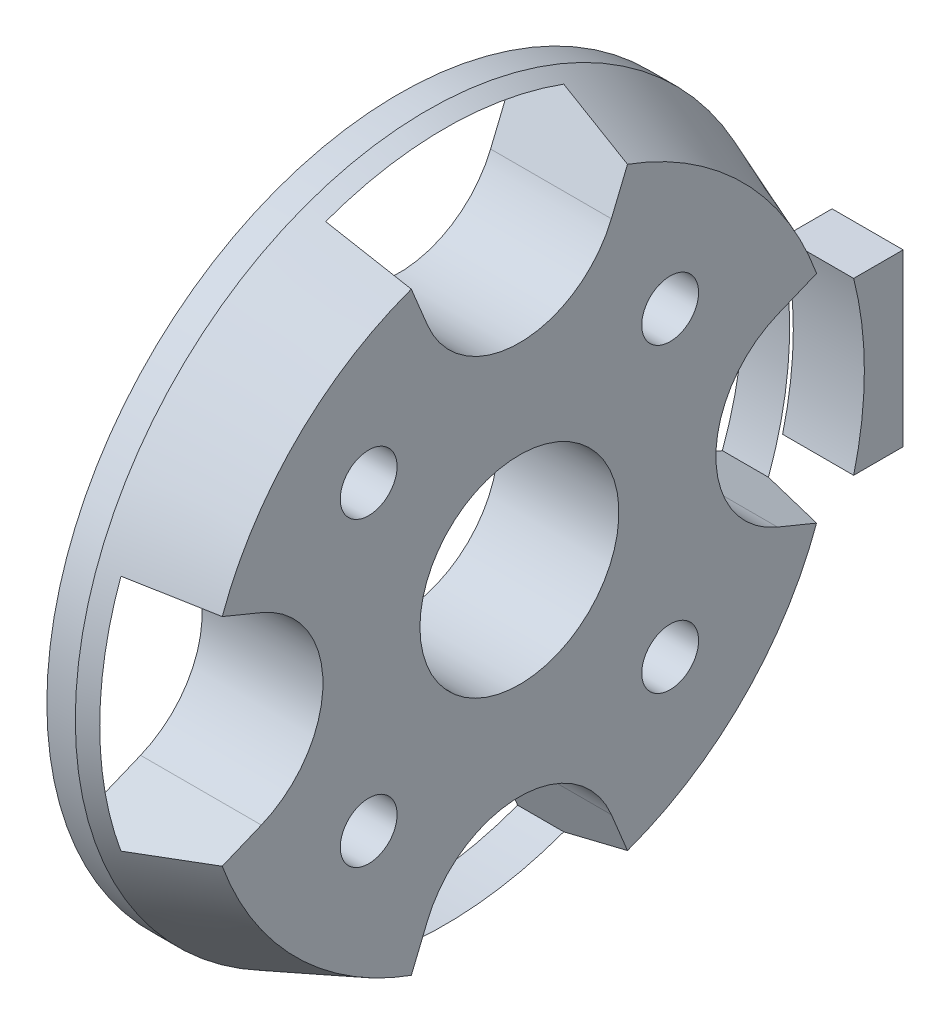
ISO-10303-21;
HEADER;
FILE_DESCRIPTION(('STEP AP214'),'2;1');
FILE_NAME('part.step','',(''),(''),'','','');
FILE_SCHEMA(('AUTOMOTIVE_DESIGN { 1 0 10303 214 1 1 1 1 }'));
ENDSEC;
DATA;
#1=APPLICATION_CONTEXT('core data for automotive mechanical design processes');
#2=APPLICATION_PROTOCOL_DEFINITION('international standard','automotive_design',2000,#1);
#3=PRODUCT_CONTEXT('',#1,'mechanical');
#4=PRODUCT('Part','Part','',(#3));
#5=PRODUCT_RELATED_PRODUCT_CATEGORY('part','',(#4));
#6=PRODUCT_DEFINITION_FORMATION('','',#4);
#7=PRODUCT_DEFINITION_CONTEXT('part definition',#1,'design');
#8=PRODUCT_DEFINITION('design','',#6,#7);
#9=PRODUCT_DEFINITION_SHAPE('','',#8);
#10=(LENGTH_UNIT() NAMED_UNIT(*) SI_UNIT(.MILLI.,.METRE.));
#11=(NAMED_UNIT(*) PLANE_ANGLE_UNIT() SI_UNIT($,.RADIAN.));
#12=(NAMED_UNIT(*) SI_UNIT($,.STERADIAN.) SOLID_ANGLE_UNIT());
#13=UNCERTAINTY_MEASURE_WITH_UNIT(LENGTH_MEASURE(1.E-05),#10,'distance_accuracy_value','');
#14=(GEOMETRIC_REPRESENTATION_CONTEXT(3) GLOBAL_UNCERTAINTY_ASSIGNED_CONTEXT((#13)) GLOBAL_UNIT_ASSIGNED_CONTEXT((#10,
#11,#12)) REPRESENTATION_CONTEXT('',''));
#15=CARTESIAN_POINT('',(0.,0.,0.));
#16=DIRECTION('',(0.,0.,1.));
#17=DIRECTION('',(1.,0.,0.));
#18=AXIS2_PLACEMENT_3D('',#15,#16,#17);
#19=CARTESIAN_POINT('',(0.,7.,0.));
#20=DIRECTION('',(1.,0.,0.));
#21=DIRECTION('',(0.,0.,-1.));
#22=AXIS2_PLACEMENT_3D('',#19,#20,#21);
#23=PLANE('',#22);
#24=DIRECTION('',(0.,0.38090446323325,-0.9246144006498));
#25=VECTOR('',#24,1.);
#26=CARTESIAN_POINT('',(0.,-7.60601927752442,20.909590401295));
#27=LINE('',#26,#25);
#28=CARTESIAN_POINT('',(0.,-8.37682312071493,22.7806536265471));
#29=VERTEX_POINT('',#28);
#30=CARTESIAN_POINT('',(0.,-6.47230080454868,18.1575816232981));
#31=VERTEX_POINT('',#30);
#32=EDGE_CURVE('E302',#29,#31,#27,.T.);
#33=ORIENTED_EDGE('',*,*,#32,.T.);
#34=CARTESIAN_POINT('',(0.,0.,20.8239128659309));
#35=DIRECTION('',(1.,0.,0.));
#36=DIRECTION('',(0.,1.,0.));
#37=AXIS2_PLACEMENT_3D('',#34,#35,#36);
#38=CIRCLE('',#37,7.);
#39=CARTESIAN_POINT('',(0.,6.47230080454855,18.1575816232982));
#40=VERTEX_POINT('',#39);
#41=EDGE_CURVE('E123',#31,#40,#38,.T.);
#42=ORIENTED_EDGE('',*,*,#41,.T.);
#43=DIRECTION('',(0.,0.380904463233244,0.924614400649803));
#44=VECTOR('',#43,1.);
#45=CARTESIAN_POINT('',(0.,6.47230080454855,18.1575816232982));
#46=LINE('',#45,#44);
#47=CARTESIAN_POINT('',(0.,8.37682312071477,22.7806536265472));
#48=VERTEX_POINT('',#47);
#49=EDGE_CURVE('E305',#40,#48,#46,.T.);
#50=ORIENTED_EDGE('',*,*,#49,.T.);
#51=CARTESIAN_POINT('',(0.,0.,0.));
#52=DIRECTION('',(1.,0.,0.));
#53=DIRECTION('',(0.,1.,0.));
#54=AXIS2_PLACEMENT_3D('',#51,#52,#53);
#55=CIRCLE('',#54,24.2719868417989);
#56=EDGE_CURVE('E257',#48,#29,#55,.T.);
#57=ORIENTED_EDGE('',*,*,#56,.T.);
#58=EDGE_LOOP('',(#33,#42,#50,#57));
#59=FACE_BOUND('',#58,.T.);
#60=DIRECTION('',(0.,0.924614400649802,0.380904463233247));
#61=VECTOR('',#60,1.);
#62=CARTESIAN_POINT('',(0.,-20.909590401295,-7.60601927752435));
#63=LINE('',#62,#61);
#64=CARTESIAN_POINT('',(0.,-22.7806536265472,-8.37682312071485));
#65=VERTEX_POINT('',#64);
#66=CARTESIAN_POINT('',(0.,-18.1575816232982,-6.47230080454862));
#67=VERTEX_POINT('',#66);
#68=EDGE_CURVE('E290',#65,#67,#63,.T.);
#69=ORIENTED_EDGE('',*,*,#68,.T.);
#70=CARTESIAN_POINT('',(0.,-20.8239128659309,0.));
#71=DIRECTION('',(1.,0.,0.));
#72=DIRECTION('',(0.,0.,1.));
#73=AXIS2_PLACEMENT_3D('',#70,#71,#72);
#74=CIRCLE('',#73,7.);
#75=CARTESIAN_POINT('',(0.,-18.1575816232982,6.47230080454861));
#76=VERTEX_POINT('',#75);
#77=EDGE_CURVE('E288',#67,#76,#74,.T.);
#78=ORIENTED_EDGE('',*,*,#77,.T.);
#79=DIRECTION('',(0.,-0.924614400649801,0.380904463233247));
#80=VECTOR('',#79,1.);
#81=CARTESIAN_POINT('',(0.,-18.1575816232982,6.47230080454861));
#82=LINE('',#81,#80);
#83=CARTESIAN_POINT('',(0.,-22.7806536265472,8.37682312071485));
#84=VERTEX_POINT('',#83);
#85=EDGE_CURVE('E275',#76,#84,#82,.T.);
#86=ORIENTED_EDGE('',*,*,#85,.T.);
#87=CARTESIAN_POINT('',(0.,0.,0.));
#88=DIRECTION('',(1.,0.,0.));
#89=DIRECTION('',(0.,0.,1.));
#90=AXIS2_PLACEMENT_3D('',#87,#88,#89);
#91=CIRCLE('',#90,24.2719868417989);
#92=EDGE_CURVE('E263',#84,#65,#91,.T.);
#93=ORIENTED_EDGE('',*,*,#92,.T.);
#94=EDGE_LOOP('',(#69,#78,#86,#93));
#95=FACE_BOUND('',#94,.T.);
#96=DIRECTION('',(0.,-0.380904463233256,0.924614400649798));
#97=VECTOR('',#96,1.);
#98=CARTESIAN_POINT('',(0.,7.60601927752457,-20.9095904012949));
#99=LINE('',#98,#97);
#100=CARTESIAN_POINT('',(0.,8.37682312071509,-22.7806536265471));
#101=VERTEX_POINT('',#100);
#102=CARTESIAN_POINT('',(0.,6.4723008045488,-18.1575816232981));
#103=VERTEX_POINT('',#102);
#104=EDGE_CURVE('E274',#101,#103,#99,.T.);
#105=ORIENTED_EDGE('',*,*,#104,.T.);
#106=CARTESIAN_POINT('',(0.,2.18118909519279E-13,-20.8239128659309));
#107=DIRECTION('',(1.,0.,0.));
#108=DIRECTION('',(0.,-1.,0.));
#109=AXIS2_PLACEMENT_3D('',#106,#107,#108);
#110=CIRCLE('',#109,7.);
#111=CARTESIAN_POINT('',(0.,-6.47230080454842,-18.1575816232982));
#112=VERTEX_POINT('',#111);
#113=EDGE_CURVE('E508',#103,#112,#110,.T.);
#114=ORIENTED_EDGE('',*,*,#113,.T.);
#115=DIRECTION('',(0.,-0.380904463233238,-0.924614400649805));
#116=VECTOR('',#115,1.);
#117=CARTESIAN_POINT('',(0.,-6.47230080454842,-18.1575816232982));
#118=LINE('',#117,#116);
#119=CARTESIAN_POINT('',(0.,-8.37682312071462,-22.7806536265473));
#120=VERTEX_POINT('',#119);
#121=EDGE_CURVE('E513',#112,#120,#118,.T.);
#122=ORIENTED_EDGE('',*,*,#121,.T.);
#123=CARTESIAN_POINT('',(0.,0.,0.));
#124=DIRECTION('',(1.,0.,0.));
#125=DIRECTION('',(0.,-1.,0.));
#126=AXIS2_PLACEMENT_3D('',#123,#124,#125);
#127=CIRCLE('',#126,24.2719868417989);
#128=EDGE_CURVE('E509',#120,#101,#127,.T.);
#129=ORIENTED_EDGE('',*,*,#128,.T.);
#130=EDGE_LOOP('',(#105,#114,#122,#129));
#131=FACE_BOUND('',#130,.T.);
#132=DIRECTION('',(0.,-0.924614400649802,-0.380904463233247));
#133=VECTOR('',#132,1.);
#134=CARTESIAN_POINT('',(0.,20.909590401295,7.60601927752435));
#135=LINE('',#134,#133);
#136=CARTESIAN_POINT('',(0.,22.7806536265472,8.37682312071485));
#137=VERTEX_POINT('',#136);
#138=CARTESIAN_POINT('',(0.,18.1575816232982,6.47230080454862));
#139=VERTEX_POINT('',#138);
#140=EDGE_CURVE('E512',#137,#139,#135,.T.);
#141=ORIENTED_EDGE('',*,*,#140,.T.);
#142=CARTESIAN_POINT('',(0.,20.8239128659309,0.));
#143=DIRECTION('',(1.,0.,0.));
#144=DIRECTION('',(0.,0.,-1.));
#145=AXIS2_PLACEMENT_3D('',#142,#143,#144);
#146=CIRCLE('',#145,7.);
#147=CARTESIAN_POINT('',(0.,18.1575816232982,-6.47230080454861));
#148=VERTEX_POINT('',#147);
#149=EDGE_CURVE('E880',#139,#148,#146,.T.);
#150=ORIENTED_EDGE('',*,*,#149,.T.);
#151=DIRECTION('',(0.,0.924614400649801,-0.380904463233247));
#152=VECTOR('',#151,1.);
#153=CARTESIAN_POINT('',(0.,18.1575816232982,-6.47230080454861));
#154=LINE('',#153,#152);
#155=CARTESIAN_POINT('',(0.,22.7806536265472,-8.37682312071485));
#156=VERTEX_POINT('',#155);
#157=EDGE_CURVE('E884',#148,#156,#154,.T.);
#158=ORIENTED_EDGE('',*,*,#157,.T.);
#159=CARTESIAN_POINT('',(0.,0.,0.));
#160=DIRECTION('',(1.,0.,0.));
#161=DIRECTION('',(0.,0.,-1.));
#162=AXIS2_PLACEMENT_3D('',#159,#160,#161);
#163=CIRCLE('',#162,24.2719868417989);
#164=EDGE_CURVE('E401',#156,#137,#163,.T.);
#165=ORIENTED_EDGE('',*,*,#164,.T.);
#166=EDGE_LOOP('',(#141,#150,#158,#165));
#167=FACE_BOUND('',#166,.T.);
#168=CARTESIAN_POINT('',(0.,0.,0.));
#169=DIRECTION('',(-1.,0.,0.));
#170=DIRECTION('',(0.,0.,1.));
#171=AXIS2_PLACEMENT_3D('',#168,#169,#170);
#172=CIRCLE('',#171,7.);
#173=CARTESIAN_POINT('',(0.,0.,7.));
#174=VERTEX_POINT('',#173);
#175=EDGE_CURVE('E408',#174,#174,#172,.T.);
#176=ORIENTED_EDGE('',*,*,#175,.F.);
#177=EDGE_LOOP('',(#176));
#178=FACE_BOUND('',#177,.T.);
#179=CARTESIAN_POINT('',(0.,0.,0.));
#180=DIRECTION('',(-1.,0.,0.));
#181=DIRECTION('',(0.,0.,1.));
#182=AXIS2_PLACEMENT_3D('',#179,#180,#181);
#183=CIRCLE('',#182,24.75);
#184=CARTESIAN_POINT('',(0.,0.,24.75));
#185=VERTEX_POINT('',#184);
#186=EDGE_CURVE('E395',#185,#185,#183,.T.);
#187=ORIENTED_EDGE('',*,*,#186,.T.);
#188=EDGE_LOOP('',(#187));
#189=FACE_BOUND('',#188,.T.);
#190=ADVANCED_FACE('F119',(#59,#95,#131,#167,#178,#189),#23,.F.);
#191=CARTESIAN_POINT('',(0.,0.,0.));
#192=DIRECTION('',(-1.,0.,0.));
#193=DIRECTION('',(0.,0.,1.));
#194=AXIS2_PLACEMENT_3D('',#191,#192,#193);
#195=CYLINDRICAL_SURFACE('',#194,24.75);
#196=ORIENTED_EDGE('',*,*,#186,.F.);
#197=EDGE_LOOP('',(#196));
#198=FACE_BOUND('',#197,.T.);
#199=CARTESIAN_POINT('',(2.,0.,0.));
#200=DIRECTION('',(-1.,0.,0.));
#201=DIRECTION('',(0.,0.,1.));
#202=AXIS2_PLACEMENT_3D('',#199,#200,#201);
#203=CIRCLE('',#202,24.75);
#204=CARTESIAN_POINT('',(2.,0.,24.75));
#205=VERTEX_POINT('',#204);
#206=EDGE_CURVE('E398',#205,#205,#203,.T.);
#207=ORIENTED_EDGE('',*,*,#206,.T.);
#208=EDGE_LOOP('',(#207));
#209=FACE_BOUND('',#208,.T.);
#210=ADVANCED_FACE('F383',(#198,#209),#195,.T.);
#211=CARTESIAN_POINT('',(8.5,0.,0.));
#212=DIRECTION('',(-1.,0.,0.));
#213=DIRECTION('',(0.,0.,1.));
#214=AXIS2_PLACEMENT_3D('',#211,#212,#213);
#215=CONICAL_SURFACE('',#214,22.25,0.367173833818219);
#216=CARTESIAN_POINT('',(8.5,0.,0.));
#217=DIRECTION('',(-1.,0.,0.));
#218=DIRECTION('',(0.,0.,1.));
#219=AXIS2_PLACEMENT_3D('',#216,#217,#218);
#220=CIRCLE('',#219,22.25);
#221=CARTESIAN_POINT('',(8.5,-20.909590401295,7.60601927752435));
#222=VERTEX_POINT('',#221);
#223=CARTESIAN_POINT('',(8.5,-7.60601927752443,20.909590401295));
#224=VERTEX_POINT('',#223);
#225=EDGE_CURVE('E337',#222,#224,#220,.T.);
#226=ORIENTED_EDGE('',*,*,#225,.T.);
#227=CARTESIAN_POINT('',(8.5002,-7.60598995144667,20.9095192146421));
#228=CARTESIAN_POINT('',(7.62388662285031,-7.73448371358894,21.2214273027278));
#229=CARTESIAN_POINT('',(6.74756928672295,-7.86297355810516,21.5333258810971));
#230=CARTESIAN_POINT('',(4.99492669652336,-8.11994541188394,22.1571040183988));
#231=CARTESIAN_POINT('',(4.11860144245114,-8.2484274211465,22.4689835773312));
#232=CARTESIAN_POINT('',(3.24227222940124,-8.37690551278301,22.7808536265471));
#233=B_SPLINE_CURVE_WITH_KNOTS('',3,(#227,#228,#229,#230,#231,#232),.UNSPECIFIED.,.F.,.F.,(4,2,
4),(0.,2.81700229541426,5.63400459079478),.UNSPECIFIED.);
#234=CARTESIAN_POINT('',(3.24283421132282,-8.37682312071493,22.7806536265471));
#235=VERTEX_POINT('',#234);
#236=EDGE_CURVE('E339',#224,#235,#233,.T.);
#237=ORIENTED_EDGE('',*,*,#236,.T.);
#238=CARTESIAN_POINT('',(3.24283421132282,0.,0.));
#239=DIRECTION('',(-1.,0.,0.));
#240=DIRECTION('',(0.,0.,1.));
#241=AXIS2_PLACEMENT_3D('',#238,#239,#240);
#242=CIRCLE('',#241,24.2719868417989);
#243=CARTESIAN_POINT('',(3.24283421132282,8.37682312071477,22.7806536265472));
#244=VERTEX_POINT('',#243);
#245=EDGE_CURVE('E333',#235,#244,#242,.T.);
#246=ORIENTED_EDGE('',*,*,#245,.T.);
#247=CARTESIAN_POINT('',(3.24227222940126,8.37690551278286,22.7808536265472));
#248=CARTESIAN_POINT('',(4.11860144245115,8.24842742114635,22.4689835773313));
#249=CARTESIAN_POINT('',(4.99492669652337,8.11994541188379,22.1571040183988));
#250=CARTESIAN_POINT('',(6.74756928672296,7.86297355810501,21.5333258810971));
#251=CARTESIAN_POINT('',(7.62388662285032,7.73448371358879,21.2214273027279));
#252=CARTESIAN_POINT('',(8.5002,7.60598995144652,20.9095192146421));
#253=B_SPLINE_CURVE_WITH_KNOTS('',3,(#247,#248,#249,#250,#251,#252),.UNSPECIFIED.,.F.,.F.,(4,2,
4),(0.,2.81700229538052,5.63400459079476),.UNSPECIFIED.);
#254=CARTESIAN_POINT('',(8.5,7.60601927752428,20.909590401295));
#255=VERTEX_POINT('',#254);
#256=EDGE_CURVE('E325',#244,#255,#253,.T.);
#257=ORIENTED_EDGE('',*,*,#256,.T.);
#258=CARTESIAN_POINT('',(8.5,20.909590401295,7.60601927752435));
#259=VERTEX_POINT('',#258);
#260=EDGE_CURVE('E321',#255,#259,#220,.T.);
#261=ORIENTED_EDGE('',*,*,#260,.T.);
#262=CARTESIAN_POINT('',(8.5002,20.9095192146421,7.60598995144659));
#263=CARTESIAN_POINT('',(7.62388662285031,21.2214273027279,7.73448371358887));
#264=CARTESIAN_POINT('',(6.74756928672295,21.5333258810971,7.86297355810508));
#265=CARTESIAN_POINT('',(4.99492669652336,22.1571040183988,8.11994541188386));
#266=CARTESIAN_POINT('',(4.11860144245114,22.4689835773312,8.24842742114642));
#267=CARTESIAN_POINT('',(3.24227222940124,22.7808536265472,8.37690551278293));
#268=B_SPLINE_CURVE_WITH_KNOTS('',3,(#262,#263,#264,#265,#266,#267),.UNSPECIFIED.,.F.,.F.,(4,2,
4),(0.,2.81700229541426,5.63400459079478),.UNSPECIFIED.);
#269=CARTESIAN_POINT('',(3.24283421132282,22.7806536265472,8.37682312071485));
#270=VERTEX_POINT('',#269);
#271=EDGE_CURVE('E335',#259,#270,#268,.T.);
#272=ORIENTED_EDGE('',*,*,#271,.T.);
#273=CARTESIAN_POINT('',(3.24283421132282,0.,0.));
#274=DIRECTION('',(-1.,0.,0.));
#275=DIRECTION('',(0.,0.,1.));
#276=AXIS2_PLACEMENT_3D('',#273,#274,#275);
#277=CIRCLE('',#276,24.2719868417989);
#278=CARTESIAN_POINT('',(3.24283421132281,22.7806536265472,-8.37682312071485));
#279=VERTEX_POINT('',#278);
#280=EDGE_CURVE('E443',#270,#279,#277,.T.);
#281=ORIENTED_EDGE('',*,*,#280,.T.);
#282=CARTESIAN_POINT('',(3.24227222940126,22.7808536265472,-8.37690551278294));
#283=CARTESIAN_POINT('',(4.11860144245115,22.4689835773312,-8.24842742114643));
#284=CARTESIAN_POINT('',(4.99492669652337,22.1571040183988,-8.11994541188386));
#285=CARTESIAN_POINT('',(6.74756928672296,21.5333258810971,-7.86297355810508));
#286=CARTESIAN_POINT('',(7.62388662285032,21.2214273027279,-7.73448371358887));
#287=CARTESIAN_POINT('',(8.5002,20.9095192146421,-7.6059899514466));
#288=B_SPLINE_CURVE_WITH_KNOTS('',3,(#282,#283,#284,#285,#286,#287),.UNSPECIFIED.,.F.,.F.,(4,2,
4),(0.,2.81700229538052,5.63400459079477),.UNSPECIFIED.);
#289=CARTESIAN_POINT('',(8.5,20.909590401295,-7.60601927752435));
#290=VERTEX_POINT('',#289);
#291=EDGE_CURVE('E444',#279,#290,#288,.T.);
#292=ORIENTED_EDGE('',*,*,#291,.T.);
#293=CARTESIAN_POINT('',(8.5,7.60601927752457,-20.9095904012949));
#294=VERTEX_POINT('',#293);
#295=EDGE_CURVE('E338',#290,#294,#220,.T.);
#296=ORIENTED_EDGE('',*,*,#295,.T.);
#297=CARTESIAN_POINT('',(8.5002,7.60598995144681,-20.909519214642));
#298=CARTESIAN_POINT('',(7.62388662285031,7.73448371358909,-21.2214273027278));
#299=CARTESIAN_POINT('',(6.74756928672295,7.86297355810531,-21.533325881097));
#300=CARTESIAN_POINT('',(4.99492669652336,8.11994541188409,-22.1571040183987));
#301=CARTESIAN_POINT('',(4.11860144245114,8.24842742114666,-22.4689835773312));
#302=CARTESIAN_POINT('',(3.24227222940124,8.37690551278317,-22.7808536265471));
#303=B_SPLINE_CURVE_WITH_KNOTS('',3,(#297,#298,#299,#300,#301,#302),.UNSPECIFIED.,.F.,.F.,(4,2,
4),(0.,2.81700229541426,5.63400459079478),.UNSPECIFIED.);
#304=CARTESIAN_POINT('',(3.24283421132282,8.37682312071509,-22.7806536265471));
#305=VERTEX_POINT('',#304);
#306=EDGE_CURVE('E481',#294,#305,#303,.T.);
#307=ORIENTED_EDGE('',*,*,#306,.T.);
#308=CARTESIAN_POINT('',(3.24283421132282,0.,0.));
#309=DIRECTION('',(-1.,0.,0.));
#310=DIRECTION('',(0.,0.,1.));
#311=AXIS2_PLACEMENT_3D('',#308,#309,#310);
#312=CIRCLE('',#311,24.2719868417989);
#313=CARTESIAN_POINT('',(3.24283421132282,-8.37682312071462,-22.7806536265473));
#314=VERTEX_POINT('',#313);
#315=EDGE_CURVE('E480',#305,#314,#312,.T.);
#316=ORIENTED_EDGE('',*,*,#315,.T.);
#317=CARTESIAN_POINT('',(3.24227222940126,-8.3769055127827,-22.7808536265473));
#318=CARTESIAN_POINT('',(4.11860144245115,-8.24842742114619,-22.4689835773313));
#319=CARTESIAN_POINT('',(4.99492669652337,-8.11994541188363,-22.1571040183989));
#320=CARTESIAN_POINT('',(6.74756928672296,-7.86297355810486,-21.5333258810972));
#321=CARTESIAN_POINT('',(7.62388662285032,-7.73448371358865,-21.2214273027279));
#322=CARTESIAN_POINT('',(8.5002,-7.60598995144638,-20.9095192146422));
#323=B_SPLINE_CURVE_WITH_KNOTS('',3,(#317,#318,#319,#320,#321,#322),.UNSPECIFIED.,.F.,.F.,(4,2,
4),(0.,2.81700229538052,5.63400459079476),.UNSPECIFIED.);
#324=CARTESIAN_POINT('',(8.5,-7.60601927752414,-20.9095904012951));
#325=VERTEX_POINT('',#324);
#326=EDGE_CURVE('E472',#314,#325,#323,.T.);
#327=ORIENTED_EDGE('',*,*,#326,.T.);
#328=CARTESIAN_POINT('',(8.5,-20.909590401295,-7.60601927752435));
#329=VERTEX_POINT('',#328);
#330=EDGE_CURVE('E400',#325,#329,#220,.T.);
#331=ORIENTED_EDGE('',*,*,#330,.T.);
#332=CARTESIAN_POINT('',(8.5002,-20.9095192146421,-7.60598995144659));
#333=CARTESIAN_POINT('',(7.62388662285031,-21.2214273027279,-7.73448371358887));
#334=CARTESIAN_POINT('',(6.74756928672295,-21.5333258810971,-7.86297355810508));
#335=CARTESIAN_POINT('',(4.99492669652336,-22.1571040183988,-8.11994541188386));
#336=CARTESIAN_POINT('',(4.11860144245114,-22.4689835773312,-8.24842742114642));
#337=CARTESIAN_POINT('',(3.24227222940124,-22.7808536265472,-8.37690551278293));
#338=B_SPLINE_CURVE_WITH_KNOTS('',3,(#332,#333,#334,#335,#336,#337),.UNSPECIFIED.,.F.,.F.,(4,2,
4),(0.,2.81700229541426,5.63400459079478),.UNSPECIFIED.);
#339=CARTESIAN_POINT('',(3.24283421132282,-22.7806536265472,-8.37682312071485));
#340=VERTEX_POINT('',#339);
#341=EDGE_CURVE('E355',#329,#340,#338,.T.);
#342=ORIENTED_EDGE('',*,*,#341,.T.);
#343=CARTESIAN_POINT('',(3.24283421132282,0.,0.));
#344=DIRECTION('',(-1.,0.,0.));
#345=DIRECTION('',(0.,0.,1.));
#346=AXIS2_PLACEMENT_3D('',#343,#344,#345);
#347=CIRCLE('',#346,24.2719868417989);
#348=CARTESIAN_POINT('',(3.24283421132281,-22.7806536265472,8.37682312071485));
#349=VERTEX_POINT('',#348);
#350=EDGE_CURVE('E534',#340,#349,#347,.T.);
#351=ORIENTED_EDGE('',*,*,#350,.T.);
#352=CARTESIAN_POINT('',(3.24227222940126,-22.7808536265472,8.37690551278294));
#353=CARTESIAN_POINT('',(4.11860144245115,-22.4689835773312,8.24842742114643));
#354=CARTESIAN_POINT('',(4.99492669652337,-22.1571040183988,8.11994541188386));
#355=CARTESIAN_POINT('',(6.74756928672296,-21.5333258810971,7.86297355810508));
#356=CARTESIAN_POINT('',(7.62388662285032,-21.2214273027279,7.73448371358887));
#357=CARTESIAN_POINT('',(8.5002,-20.9095192146421,7.6059899514466));
#358=B_SPLINE_CURVE_WITH_KNOTS('',3,(#352,#353,#354,#355,#356,#357),.UNSPECIFIED.,.F.,.F.,(4,2,
4),(0.,2.81700229538052,5.63400459079477),.UNSPECIFIED.);
#359=EDGE_CURVE('E283',#349,#222,#358,.T.);
#360=ORIENTED_EDGE('',*,*,#359,.T.);
#361=EDGE_LOOP('',(#226,#237,#246,#257,#261,#272,#281,#292,#296,#307,#316,#327,#331,#342,#351,#360));
#362=FACE_BOUND('',#361,.T.);
#363=ORIENTED_EDGE('',*,*,#206,.F.);
#364=EDGE_LOOP('',(#363));
#365=FACE_BOUND('',#364,.T.);
#366=ADVANCED_FACE('F328',(#362,#365),#215,.T.);
#367=CARTESIAN_POINT('',(8.5,22.25,0.));
#368=DIRECTION('',(-1.,0.,0.));
#369=DIRECTION('',(0.,0.,1.));
#370=AXIS2_PLACEMENT_3D('',#367,#368,#369);
#371=PLANE('',#370);
#372=CARTESIAN_POINT('',(8.5,0.,20.8239128659309));
#373=DIRECTION('',(1.,0.,0.));
#374=DIRECTION('',(0.,1.,0.));
#375=AXIS2_PLACEMENT_3D('',#372,#373,#374);
#376=CIRCLE('',#375,7.);
#377=CARTESIAN_POINT('',(8.5,-6.47230080454868,18.1575816232981));
#378=VERTEX_POINT('',#377);
#379=CARTESIAN_POINT('',(8.5,6.47230080454855,18.1575816232982));
#380=VERTEX_POINT('',#379);
#381=EDGE_CURVE('E128',#378,#380,#376,.T.);
#382=ORIENTED_EDGE('',*,*,#381,.F.);
#383=DIRECTION('',(0.,-0.38090446323325,0.9246144006498));
#384=VECTOR('',#383,1.);
#385=CARTESIAN_POINT('',(8.5,4.08988057786929,-7.48124897890094));
#386=LINE('',#385,#384);
#387=EDGE_CURVE('E317',#378,#224,#386,.T.);
#388=ORIENTED_EDGE('',*,*,#387,.T.);
#389=ORIENTED_EDGE('',*,*,#225,.F.);
#390=DIRECTION('',(0.,-0.924614400649801,0.380904463233248));
#391=VECTOR('',#390,1.);
#392=CARTESIAN_POINT('',(8.5,-20.909590401295,7.60601927752435));
#393=LINE('',#392,#391);
#394=CARTESIAN_POINT('',(8.5,-18.1575816232982,6.47230080454862));
#395=VERTEX_POINT('',#394);
#396=EDGE_CURVE('E519',#395,#222,#393,.T.);
#397=ORIENTED_EDGE('',*,*,#396,.F.);
#398=CARTESIAN_POINT('',(8.5,-20.8239128659309,0.));
#399=DIRECTION('',(1.,0.,0.));
#400=DIRECTION('',(0.,0.,1.));
#401=AXIS2_PLACEMENT_3D('',#398,#399,#400);
#402=CIRCLE('',#401,7.);
#403=CARTESIAN_POINT('',(8.5,-18.1575816232982,-6.47230080454862));
#404=VERTEX_POINT('',#403);
#405=EDGE_CURVE('E524',#404,#395,#402,.T.);
#406=ORIENTED_EDGE('',*,*,#405,.F.);
#407=DIRECTION('',(0.,-0.924614400649802,-0.380904463233247));
#408=VECTOR('',#407,1.);
#409=CARTESIAN_POINT('',(8.5,18.6668143224373,8.69788988439297));
#410=LINE('',#409,#408);
#411=EDGE_CURVE('E530',#404,#329,#410,.T.);
#412=ORIENTED_EDGE('',*,*,#411,.T.);
#413=ORIENTED_EDGE('',*,*,#330,.F.);
#414=DIRECTION('',(0.,-0.380904463233238,-0.924614400649805));
#415=VECTOR('',#414,1.);
#416=CARTESIAN_POINT('',(8.5,-7.60601927752413,-20.9095904012951));
#417=LINE('',#416,#415);
#418=CARTESIAN_POINT('',(8.5,-6.47230080454842,-18.1575816232982));
#419=VERTEX_POINT('',#418);
#420=EDGE_CURVE('E491',#419,#325,#417,.T.);
#421=ORIENTED_EDGE('',*,*,#420,.F.);
#422=CARTESIAN_POINT('',(8.5,2.18118909519279E-13,-20.8239128659309));
#423=DIRECTION('',(1.,0.,0.));
#424=DIRECTION('',(0.,-1.,0.));
#425=AXIS2_PLACEMENT_3D('',#422,#423,#424);
#426=CIRCLE('',#425,7.);
#427=CARTESIAN_POINT('',(8.5,6.4723008045488,-18.1575816232981));
#428=VERTEX_POINT('',#427);
#429=EDGE_CURVE('E496',#428,#419,#426,.T.);
#430=ORIENTED_EDGE('',*,*,#429,.F.);
#431=DIRECTION('',(0.,-0.380904463233257,0.924614400649798));
#432=VECTOR('',#431,1.);
#433=CARTESIAN_POINT('',(8.5,6.4723008045488,-18.1575816232981));
#434=LINE('',#433,#432);
#435=EDGE_CURVE('E499',#294,#428,#434,.T.);
#436=ORIENTED_EDGE('',*,*,#435,.F.);
#437=ORIENTED_EDGE('',*,*,#295,.F.);
#438=DIRECTION('',(0.,0.924614400649801,-0.380904463233248));
#439=VECTOR('',#438,1.);
#440=CARTESIAN_POINT('',(8.5,20.909590401295,-7.60601927752435));
#441=LINE('',#440,#439);
#442=CARTESIAN_POINT('',(8.5,18.1575816232982,-6.47230080454861));
#443=VERTEX_POINT('',#442);
#444=EDGE_CURVE('E892',#443,#290,#441,.T.);
#445=ORIENTED_EDGE('',*,*,#444,.F.);
#446=CARTESIAN_POINT('',(8.5,20.8239128659309,0.));
#447=DIRECTION('',(1.,0.,0.));
#448=DIRECTION('',(0.,0.,-1.));
#449=AXIS2_PLACEMENT_3D('',#446,#447,#448);
#450=CIRCLE('',#449,7.);
#451=CARTESIAN_POINT('',(8.5,18.1575816232982,6.47230080454862));
#452=VERTEX_POINT('',#451);
#453=EDGE_CURVE('E890',#452,#443,#450,.T.);
#454=ORIENTED_EDGE('',*,*,#453,.F.);
#455=DIRECTION('',(0.,0.924614400649802,0.380904463233247));
#456=VECTOR('',#455,1.);
#457=CARTESIAN_POINT('',(8.5,19.3767603276228,6.97455407859435));
#458=LINE('',#457,#456);
#459=EDGE_CURVE('E409',#452,#259,#458,.T.);
#460=ORIENTED_EDGE('',*,*,#459,.T.);
#461=ORIENTED_EDGE('',*,*,#260,.F.);
#462=DIRECTION('',(0.,0.380904463233245,0.924614400649803));
#463=VECTOR('',#462,1.);
#464=CARTESIAN_POINT('',(8.5,7.60601927752428,20.909590401295));
#465=LINE('',#464,#463);
#466=EDGE_CURVE('E295',#380,#255,#465,.T.);
#467=ORIENTED_EDGE('',*,*,#466,.F.);
#468=EDGE_LOOP('',(#382,#388,#389,#397,#406,#412,#413,#421,#430,#436,#437,#445,#454,#460,#461,#467));
#469=FACE_BOUND('',#468,.T.);
#470=CARTESIAN_POINT('',(8.5,10.6066017177976,10.6066017177982));
#471=DIRECTION('',(1.,0.,0.));
#472=DIRECTION('',(0.,0.,-1.));
#473=AXIS2_PLACEMENT_3D('',#470,#471,#472);
#474=CIRCLE('',#473,2.00000000000064);
#475=CARTESIAN_POINT('',(8.5,10.6066017177976,8.60660171779759));
#476=VERTEX_POINT('',#475);
#477=EDGE_CURVE('E423',#476,#476,#474,.T.);
#478=ORIENTED_EDGE('',*,*,#477,.F.);
#479=EDGE_LOOP('',(#478));
#480=FACE_BOUND('',#479,.T.);
#481=CARTESIAN_POINT('',(8.5,-10.6066017177988,10.6066017177976));
#482=DIRECTION('',(1.,0.,0.));
#483=DIRECTION('',(0.,0.,-1.));
#484=AXIS2_PLACEMENT_3D('',#481,#482,#483);
#485=CIRCLE('',#484,2.00000000000045);
#486=CARTESIAN_POINT('',(8.5,-10.6066017177988,8.60660171779715));
#487=VERTEX_POINT('',#486);
#488=EDGE_CURVE('E429',#487,#487,#485,.T.);
#489=ORIENTED_EDGE('',*,*,#488,.F.);
#490=EDGE_LOOP('',(#489));
#491=FACE_BOUND('',#490,.T.);
#492=CARTESIAN_POINT('',(8.5,-10.6066017177982,-10.6066017177988));
#493=DIRECTION('',(1.,0.,0.));
#494=DIRECTION('',(0.,0.,-1.));
#495=AXIS2_PLACEMENT_3D('',#492,#493,#494);
#496=CIRCLE('',#495,1.99999999999985);
#497=CARTESIAN_POINT('',(8.5,-10.6066017177982,-12.6066017177987));
#498=VERTEX_POINT('',#497);
#499=EDGE_CURVE('E418',#498,#498,#496,.T.);
#500=ORIENTED_EDGE('',*,*,#499,.F.);
#501=EDGE_LOOP('',(#500));
#502=FACE_BOUND('',#501,.T.);
#503=CARTESIAN_POINT('',(8.5,10.6066017177982,-10.6066017177982));
#504=DIRECTION('',(1.,0.,0.));
#505=DIRECTION('',(0.,0.,-1.));
#506=AXIS2_PLACEMENT_3D('',#503,#504,#505);
#507=CIRCLE('',#506,2.);
#508=CARTESIAN_POINT('',(8.5,10.6066017177982,-12.6066017177982));
#509=VERTEX_POINT('',#508);
#510=EDGE_CURVE('E412',#509,#509,#507,.T.);
#511=ORIENTED_EDGE('',*,*,#510,.F.);
#512=EDGE_LOOP('',(#511));
#513=FACE_BOUND('',#512,.T.);
#514=CARTESIAN_POINT('',(8.5,0.,0.));
#515=DIRECTION('',(-1.,0.,0.));
#516=DIRECTION('',(0.,0.,1.));
#517=AXIS2_PLACEMENT_3D('',#514,#515,#516);
#518=CIRCLE('',#517,7.);
#519=CARTESIAN_POINT('',(8.5,0.,7.));
#520=VERTEX_POINT('',#519);
#521=EDGE_CURVE('E405',#520,#520,#518,.T.);
#522=ORIENTED_EDGE('',*,*,#521,.T.);
#523=EDGE_LOOP('',(#522));
#524=FACE_BOUND('',#523,.T.);
#525=ADVANCED_FACE('F314',(#469,#480,#491,#502,#513,#524),#371,.F.);
#526=CARTESIAN_POINT('',(0.,0.,0.));
#527=DIRECTION('',(-1.,0.,0.));
#528=DIRECTION('',(0.,0.,1.));
#529=AXIS2_PLACEMENT_3D('',#526,#527,#528);
#530=CYLINDRICAL_SURFACE('',#529,7.);
#531=ORIENTED_EDGE('',*,*,#521,.F.);
#532=EDGE_LOOP('',(#531));
#533=FACE_BOUND('',#532,.T.);
#534=ORIENTED_EDGE('',*,*,#175,.T.);
#535=EDGE_LOOP('',(#534));
#536=FACE_BOUND('',#535,.T.);
#537=ADVANCED_FACE('F376',(#533,#536),#530,.F.);
#538=CARTESIAN_POINT('',(3.5,10.6066017177982,-10.6066017177982));
#539=DIRECTION('',(1.,0.,0.));
#540=DIRECTION('',(0.,0.,-1.));
#541=AXIS2_PLACEMENT_3D('',#538,#539,#540);
#542=CYLINDRICAL_SURFACE('',#541,2.);
#543=CARTESIAN_POINT('',(3.5,10.6066017177982,-10.6066017177982));
#544=DIRECTION('',(1.,0.,0.));
#545=DIRECTION('',(0.,0.,-1.));
#546=AXIS2_PLACEMENT_3D('',#543,#544,#545);
#547=CIRCLE('',#546,2.);
#548=CARTESIAN_POINT('',(3.5,10.6066017177982,-12.6066017177982));
#549=VERTEX_POINT('',#548);
#550=EDGE_CURVE('E415',#549,#549,#547,.T.);
#551=ORIENTED_EDGE('',*,*,#550,.F.);
#552=EDGE_LOOP('',(#551));
#553=FACE_BOUND('',#552,.T.);
#554=ORIENTED_EDGE('',*,*,#510,.T.);
#555=EDGE_LOOP('',(#554));
#556=FACE_BOUND('',#555,.T.);
#557=ADVANCED_FACE('F381',(#553,#556),#542,.F.);
#558=CARTESIAN_POINT('',(3.5,10.6066017177982,-10.6066017177982));
#559=DIRECTION('',(1.,0.,0.));
#560=DIRECTION('',(0.,0.,-1.));
#561=AXIS2_PLACEMENT_3D('',#558,#559,#560);
#562=PLANE('',#561);
#563=ORIENTED_EDGE('',*,*,#550,.T.);
#564=EDGE_LOOP('',(#563));
#565=FACE_BOUND('',#564,.T.);
#566=ADVANCED_FACE('F758',(#565),#562,.T.);
#567=CARTESIAN_POINT('',(3.5,-10.6066017177982,-10.6066017177988));
#568=DIRECTION('',(1.,0.,0.));
#569=DIRECTION('',(0.,0.,-1.));
#570=AXIS2_PLACEMENT_3D('',#567,#568,#569);
#571=CYLINDRICAL_SURFACE('',#570,1.99999999999985);
#572=CARTESIAN_POINT('',(3.5,-10.6066017177982,-10.6066017177988));
#573=DIRECTION('',(1.,0.,0.));
#574=DIRECTION('',(0.,0.,-1.));
#575=AXIS2_PLACEMENT_3D('',#572,#573,#574);
#576=CIRCLE('',#575,1.99999999999985);
#577=CARTESIAN_POINT('',(3.5,-10.6066017177982,-12.6066017177987));
#578=VERTEX_POINT('',#577);
#579=EDGE_CURVE('E432',#578,#578,#576,.T.);
#580=ORIENTED_EDGE('',*,*,#579,.F.);
#581=EDGE_LOOP('',(#580));
#582=FACE_BOUND('',#581,.T.);
#583=ORIENTED_EDGE('',*,*,#499,.T.);
#584=EDGE_LOOP('',(#583));
#585=FACE_BOUND('',#584,.T.);
#586=ADVANCED_FACE('F747',(#582,#585),#571,.F.);
#587=CARTESIAN_POINT('',(3.5,-10.6066017177982,-10.6066017177988));
#588=DIRECTION('',(1.,0.,0.));
#589=DIRECTION('',(0.,0.,-1.));
#590=AXIS2_PLACEMENT_3D('',#587,#588,#589);
#591=PLANE('',#590);
#592=ORIENTED_EDGE('',*,*,#579,.T.);
#593=EDGE_LOOP('',(#592));
#594=FACE_BOUND('',#593,.T.);
#595=ADVANCED_FACE('F736',(#594),#591,.T.);
#596=CARTESIAN_POINT('',(3.5,-10.6066017177988,10.6066017177976));
#597=DIRECTION('',(1.,0.,0.));
#598=DIRECTION('',(0.,0.,-1.));
#599=AXIS2_PLACEMENT_3D('',#596,#597,#598);
#600=CYLINDRICAL_SURFACE('',#599,2.00000000000045);
#601=CARTESIAN_POINT('',(3.5,-10.6066017177988,10.6066017177976));
#602=DIRECTION('',(1.,0.,0.));
#603=DIRECTION('',(0.,0.,-1.));
#604=AXIS2_PLACEMENT_3D('',#601,#602,#603);
#605=CIRCLE('',#604,2.00000000000045);
#606=CARTESIAN_POINT('',(3.5,-10.6066017177988,8.60660171779715));
#607=VERTEX_POINT('',#606);
#608=EDGE_CURVE('E426',#607,#607,#605,.T.);
#609=ORIENTED_EDGE('',*,*,#608,.F.);
#610=EDGE_LOOP('',(#609));
#611=FACE_BOUND('',#610,.T.);
#612=ORIENTED_EDGE('',*,*,#488,.T.);
#613=EDGE_LOOP('',(#612));
#614=FACE_BOUND('',#613,.T.);
#615=ADVANCED_FACE('F725',(#611,#614),#600,.F.);
#616=CARTESIAN_POINT('',(3.5,-10.6066017177988,10.6066017177976));
#617=DIRECTION('',(1.,0.,0.));
#618=DIRECTION('',(0.,0.,-1.));
#619=AXIS2_PLACEMENT_3D('',#616,#617,#618);
#620=PLANE('',#619);
#621=ORIENTED_EDGE('',*,*,#608,.T.);
#622=EDGE_LOOP('',(#621));
#623=FACE_BOUND('',#622,.T.);
#624=ADVANCED_FACE('F714',(#623),#620,.T.);
#625=CARTESIAN_POINT('',(3.5,10.6066017177976,10.6066017177982));
#626=DIRECTION('',(1.,0.,0.));
#627=DIRECTION('',(0.,0.,-1.));
#628=AXIS2_PLACEMENT_3D('',#625,#626,#627);
#629=CYLINDRICAL_SURFACE('',#628,2.00000000000064);
#630=CARTESIAN_POINT('',(3.5,10.6066017177976,10.6066017177982));
#631=DIRECTION('',(1.,0.,0.));
#632=DIRECTION('',(0.,0.,-1.));
#633=AXIS2_PLACEMENT_3D('',#630,#631,#632);
#634=CIRCLE('',#633,2.00000000000064);
#635=CARTESIAN_POINT('',(3.5,10.6066017177976,8.60660171779759));
#636=VERTEX_POINT('',#635);
#637=EDGE_CURVE('E419',#636,#636,#634,.T.);
#638=ORIENTED_EDGE('',*,*,#637,.F.);
#639=EDGE_LOOP('',(#638));
#640=FACE_BOUND('',#639,.T.);
#641=ORIENTED_EDGE('',*,*,#477,.T.);
#642=EDGE_LOOP('',(#641));
#643=FACE_BOUND('',#642,.T.);
#644=ADVANCED_FACE('F703',(#640,#643),#629,.F.);
#645=CARTESIAN_POINT('',(3.5,10.6066017177976,10.6066017177982));
#646=DIRECTION('',(1.,0.,0.));
#647=DIRECTION('',(0.,0.,-1.));
#648=AXIS2_PLACEMENT_3D('',#645,#646,#647);
#649=PLANE('',#648);
#650=ORIENTED_EDGE('',*,*,#637,.T.);
#651=EDGE_LOOP('',(#650));
#652=FACE_BOUND('',#651,.T.);
#653=ADVANCED_FACE('F693',(#652),#649,.T.);
#654=CARTESIAN_POINT('',(0.,0.,0.));
#655=DIRECTION('',(1.,0.,0.));
#656=DIRECTION('',(0.,0.,-1.));
#657=AXIS2_PLACEMENT_3D('',#654,#655,#656);
#658=CYLINDRICAL_SURFACE('',#657,24.2719868417989);
#659=DIRECTION('',(1.,0.,0.));
#660=VECTOR('',#659,1.);
#661=CARTESIAN_POINT('',(0.,22.7806536265472,8.37682312071485));
#662=LINE('',#661,#660);
#663=EDGE_CURVE('E867',#137,#270,#662,.T.);
#664=ORIENTED_EDGE('',*,*,#663,.F.);
#665=ORIENTED_EDGE('',*,*,#164,.F.);
#666=DIRECTION('',(1.,0.,0.));
#667=VECTOR('',#666,1.);
#668=CARTESIAN_POINT('',(0.,22.7806536265472,-8.37682312071485));
#669=LINE('',#668,#667);
#670=EDGE_CURVE('E422',#156,#279,#669,.T.);
#671=ORIENTED_EDGE('',*,*,#670,.T.);
#672=ORIENTED_EDGE('',*,*,#280,.F.);
#673=EDGE_LOOP('',(#664,#665,#671,#672));
#674=FACE_BOUND('',#673,.T.);
#675=ADVANCED_FACE('F457',(#674),#658,.F.);
#676=CARTESIAN_POINT('',(0.,18.1575816232982,6.47230080454862));
#677=DIRECTION('',(0.,-0.380904463233247,0.924614400649802));
#678=DIRECTION('',(0.,-0.924614400649802,-0.380904463233247));
#679=AXIS2_PLACEMENT_3D('',#676,#677,#678);
#680=PLANE('',#679);
#681=ORIENTED_EDGE('',*,*,#459,.F.);
#682=DIRECTION('',(1.,0.,0.));
#683=VECTOR('',#682,1.);
#684=CARTESIAN_POINT('',(0.,18.1575816232982,6.47230080454862));
#685=LINE('',#684,#683);
#686=EDGE_CURVE('E503',#139,#452,#685,.T.);
#687=ORIENTED_EDGE('',*,*,#686,.F.);
#688=ORIENTED_EDGE('',*,*,#140,.F.);
#689=ORIENTED_EDGE('',*,*,#663,.T.);
#690=ORIENTED_EDGE('',*,*,#271,.F.);
#691=EDGE_LOOP('',(#681,#687,#688,#689,#690));
#692=FACE_BOUND('',#691,.T.);
#693=ADVANCED_FACE('F451',(#692),#680,.F.);
#694=CARTESIAN_POINT('',(0.,20.909590401295,-7.60601927752435));
#695=DIRECTION('',(0.,-0.380904463233248,-0.924614400649801));
#696=DIRECTION('',(0.,0.924614400649801,-0.380904463233248));
#697=AXIS2_PLACEMENT_3D('',#694,#695,#696);
#698=PLANE('',#697);
#699=ORIENTED_EDGE('',*,*,#670,.F.);
#700=ORIENTED_EDGE('',*,*,#157,.F.);
#701=DIRECTION('',(1.,0.,0.));
#702=VECTOR('',#701,1.);
#703=CARTESIAN_POINT('',(0.,18.1575816232982,-6.47230080454861));
#704=LINE('',#703,#702);
#705=EDGE_CURVE('E873',#148,#443,#704,.T.);
#706=ORIENTED_EDGE('',*,*,#705,.T.);
#707=ORIENTED_EDGE('',*,*,#444,.T.);
#708=ORIENTED_EDGE('',*,*,#291,.F.);
#709=EDGE_LOOP('',(#699,#700,#706,#707,#708));
#710=FACE_BOUND('',#709,.T.);
#711=ADVANCED_FACE('F456',(#710),#698,.F.);
#712=CARTESIAN_POINT('',(0.,20.8239128659309,0.));
#713=DIRECTION('',(1.,0.,0.));
#714=DIRECTION('',(0.,0.,-1.));
#715=AXIS2_PLACEMENT_3D('',#712,#713,#714);
#716=CYLINDRICAL_SURFACE('',#715,7.);
#717=ORIENTED_EDGE('',*,*,#453,.T.);
#718=ORIENTED_EDGE('',*,*,#705,.F.);
#719=ORIENTED_EDGE('',*,*,#149,.F.);
#720=ORIENTED_EDGE('',*,*,#686,.T.);
#721=EDGE_LOOP('',(#717,#718,#719,#720));
#722=FACE_BOUND('',#721,.T.);
#723=ADVANCED_FACE('F657',(#722),#716,.F.);
#724=CARTESIAN_POINT('',(0.,6.4723008045488,-18.1575816232981));
#725=DIRECTION('',(0.,0.924614400649798,0.380904463233257));
#726=DIRECTION('',(0.,-0.380904463233257,0.924614400649798));
#727=AXIS2_PLACEMENT_3D('',#724,#725,#726);
#728=PLANE('',#727);
#729=ORIENTED_EDGE('',*,*,#435,.T.);
#730=DIRECTION('',(1.,0.,0.));
#731=VECTOR('',#730,1.);
#732=CARTESIAN_POINT('',(0.,6.4723008045488,-18.1575816232981));
#733=LINE('',#732,#731);
#734=EDGE_CURVE('E284',#103,#428,#733,.T.);
#735=ORIENTED_EDGE('',*,*,#734,.F.);
#736=ORIENTED_EDGE('',*,*,#104,.F.);
#737=DIRECTION('',(1.,0.,0.));
#738=VECTOR('',#737,1.);
#739=CARTESIAN_POINT('',(0.,8.37682312071509,-22.7806536265471));
#740=LINE('',#739,#738);
#741=EDGE_CURVE('E492',#101,#305,#740,.T.);
#742=ORIENTED_EDGE('',*,*,#741,.T.);
#743=ORIENTED_EDGE('',*,*,#306,.F.);
#744=EDGE_LOOP('',(#729,#735,#736,#742,#743));
#745=FACE_BOUND('',#744,.T.);
#746=ADVANCED_FACE('F467',(#745),#728,.F.);
#747=CARTESIAN_POINT('',(0.,-7.60601927752413,-20.9095904012951));
#748=DIRECTION('',(0.,-0.924614400649805,0.380904463233238));
#749=DIRECTION('',(0.,-0.380904463233238,-0.924614400649805));
#750=AXIS2_PLACEMENT_3D('',#747,#748,#749);
#751=PLANE('',#750);
#752=DIRECTION('',(1.,0.,0.));
#753=VECTOR('',#752,1.);
#754=CARTESIAN_POINT('',(0.,-8.37682312071462,-22.7806536265473));
#755=LINE('',#754,#753);
#756=EDGE_CURVE('E493',#120,#314,#755,.T.);
#757=ORIENTED_EDGE('',*,*,#756,.F.);
#758=ORIENTED_EDGE('',*,*,#121,.F.);
#759=DIRECTION('',(1.,0.,0.));
#760=VECTOR('',#759,1.);
#761=CARTESIAN_POINT('',(0.,-6.47230080454842,-18.1575816232982));
#762=LINE('',#761,#760);
#763=EDGE_CURVE('E488',#112,#419,#762,.T.);
#764=ORIENTED_EDGE('',*,*,#763,.T.);
#765=ORIENTED_EDGE('',*,*,#420,.T.);
#766=ORIENTED_EDGE('',*,*,#326,.F.);
#767=EDGE_LOOP('',(#757,#758,#764,#765,#766));
#768=FACE_BOUND('',#767,.T.);
#769=ADVANCED_FACE('F463',(#768),#751,.F.);
#770=CARTESIAN_POINT('',(0.,0.,0.));
#771=DIRECTION('',(1.,0.,0.));
#772=DIRECTION('',(0.,0.,-1.));
#773=AXIS2_PLACEMENT_3D('',#770,#771,#772);
#774=CYLINDRICAL_SURFACE('',#773,24.2719868417989);
#775=ORIENTED_EDGE('',*,*,#741,.F.);
#776=ORIENTED_EDGE('',*,*,#128,.F.);
#777=ORIENTED_EDGE('',*,*,#756,.T.);
#778=ORIENTED_EDGE('',*,*,#315,.F.);
#779=EDGE_LOOP('',(#775,#776,#777,#778));
#780=FACE_BOUND('',#779,.T.);
#781=ADVANCED_FACE('F121',(#780),#774,.F.);
#782=CARTESIAN_POINT('',(0.,2.18118909519279E-13,-20.8239128659309));
#783=DIRECTION('',(1.,0.,0.));
#784=DIRECTION('',(0.,0.,-1.));
#785=AXIS2_PLACEMENT_3D('',#782,#783,#784);
#786=CYLINDRICAL_SURFACE('',#785,7.);
#787=ORIENTED_EDGE('',*,*,#429,.T.);
#788=ORIENTED_EDGE('',*,*,#763,.F.);
#789=ORIENTED_EDGE('',*,*,#113,.F.);
#790=ORIENTED_EDGE('',*,*,#734,.T.);
#791=EDGE_LOOP('',(#787,#788,#789,#790));
#792=FACE_BOUND('',#791,.T.);
#793=ADVANCED_FACE('F459',(#792),#786,.F.);
#794=CARTESIAN_POINT('',(0.,0.,0.));
#795=DIRECTION('',(1.,0.,0.));
#796=DIRECTION('',(0.,0.,-1.));
#797=AXIS2_PLACEMENT_3D('',#794,#795,#796);
#798=CYLINDRICAL_SURFACE('',#797,24.2719868417989);
#799=DIRECTION('',(1.,0.,0.));
#800=VECTOR('',#799,1.);
#801=CARTESIAN_POINT('',(0.,-22.7806536265472,-8.37682312071485));
#802=LINE('',#801,#800);
#803=EDGE_CURVE('E269',#65,#340,#802,.T.);
#804=ORIENTED_EDGE('',*,*,#803,.F.);
#805=ORIENTED_EDGE('',*,*,#92,.F.);
#806=DIRECTION('',(1.,0.,0.));
#807=VECTOR('',#806,1.);
#808=CARTESIAN_POINT('',(0.,-22.7806536265472,8.37682312071485));
#809=LINE('',#808,#807);
#810=EDGE_CURVE('E266',#84,#349,#809,.T.);
#811=ORIENTED_EDGE('',*,*,#810,.T.);
#812=ORIENTED_EDGE('',*,*,#350,.F.);
#813=EDGE_LOOP('',(#804,#805,#811,#812));
#814=FACE_BOUND('',#813,.T.);
#815=ADVANCED_FACE('F265',(#814),#798,.F.);
#816=CARTESIAN_POINT('',(0.,-18.1575816232982,-6.47230080454862));
#817=DIRECTION('',(0.,0.380904463233247,-0.924614400649802));
#818=DIRECTION('',(0.,0.924614400649802,0.380904463233247));
#819=AXIS2_PLACEMENT_3D('',#816,#817,#818);
#820=PLANE('',#819);
#821=ORIENTED_EDGE('',*,*,#411,.F.);
#822=DIRECTION('',(1.,0.,0.));
#823=VECTOR('',#822,1.);
#824=CARTESIAN_POINT('',(0.,-18.1575816232982,-6.47230080454862));
#825=LINE('',#824,#823);
#826=EDGE_CURVE('E298',#67,#404,#825,.T.);
#827=ORIENTED_EDGE('',*,*,#826,.F.);
#828=ORIENTED_EDGE('',*,*,#68,.F.);
#829=ORIENTED_EDGE('',*,*,#803,.T.);
#830=ORIENTED_EDGE('',*,*,#341,.F.);
#831=EDGE_LOOP('',(#821,#827,#828,#829,#830));
#832=FACE_BOUND('',#831,.T.);
#833=ADVANCED_FACE('F527',(#832),#820,.F.);
#834=CARTESIAN_POINT('',(0.,-20.909590401295,7.60601927752435));
#835=DIRECTION('',(0.,0.380904463233248,0.924614400649801));
#836=DIRECTION('',(0.,-0.924614400649801,0.380904463233248));
#837=AXIS2_PLACEMENT_3D('',#834,#835,#836);
#838=PLANE('',#837);
#839=ORIENTED_EDGE('',*,*,#810,.F.);
#840=ORIENTED_EDGE('',*,*,#85,.F.);
#841=DIRECTION('',(1.,0.,0.));
#842=VECTOR('',#841,1.);
#843=CARTESIAN_POINT('',(0.,-18.1575816232982,6.47230080454861));
#844=LINE('',#843,#842);
#845=EDGE_CURVE('E518',#76,#395,#844,.T.);
#846=ORIENTED_EDGE('',*,*,#845,.T.);
#847=ORIENTED_EDGE('',*,*,#396,.T.);
#848=ORIENTED_EDGE('',*,*,#359,.F.);
#849=EDGE_LOOP('',(#839,#840,#846,#847,#848));
#850=FACE_BOUND('',#849,.T.);
#851=ADVANCED_FACE('F279',(#850),#838,.F.);
#852=CARTESIAN_POINT('',(0.,-20.8239128659309,0.));
#853=DIRECTION('',(1.,0.,0.));
#854=DIRECTION('',(0.,0.,-1.));
#855=AXIS2_PLACEMENT_3D('',#852,#853,#854);
#856=CYLINDRICAL_SURFACE('',#855,7.);
#857=ORIENTED_EDGE('',*,*,#405,.T.);
#858=ORIENTED_EDGE('',*,*,#845,.F.);
#859=ORIENTED_EDGE('',*,*,#77,.F.);
#860=ORIENTED_EDGE('',*,*,#826,.T.);
#861=EDGE_LOOP('',(#857,#858,#859,#860));
#862=FACE_BOUND('',#861,.T.);
#863=ADVANCED_FACE('F372',(#862),#856,.F.);
#864=CARTESIAN_POINT('',(0.,0.,0.));
#865=DIRECTION('',(1.,0.,0.));
#866=DIRECTION('',(0.,0.,-1.));
#867=AXIS2_PLACEMENT_3D('',#864,#865,#866);
#868=CYLINDRICAL_SURFACE('',#867,24.2719868417989);
#869=DIRECTION('',(1.,0.,0.));
#870=VECTOR('',#869,1.);
#871=CARTESIAN_POINT('',(0.,-8.37682312071493,22.7806536265471));
#872=LINE('',#871,#870);
#873=EDGE_CURVE('E252',#29,#235,#872,.T.);
#874=ORIENTED_EDGE('',*,*,#873,.F.);
#875=ORIENTED_EDGE('',*,*,#56,.F.);
#876=DIRECTION('',(1.,0.,0.));
#877=VECTOR('',#876,1.);
#878=CARTESIAN_POINT('',(0.,8.37682312071477,22.7806536265472));
#879=LINE('',#878,#877);
#880=EDGE_CURVE('E296',#48,#244,#879,.T.);
#881=ORIENTED_EDGE('',*,*,#880,.T.);
#882=ORIENTED_EDGE('',*,*,#245,.F.);
#883=EDGE_LOOP('',(#874,#875,#881,#882));
#884=FACE_BOUND('',#883,.T.);
#885=ADVANCED_FACE('F370',(#884),#868,.F.);
#886=CARTESIAN_POINT('',(0.,-6.47230080454868,18.1575816232981));
#887=DIRECTION('',(0.,-0.9246144006498,-0.38090446323325));
#888=DIRECTION('',(0.,0.38090446323325,-0.9246144006498));
#889=AXIS2_PLACEMENT_3D('',#886,#887,#888);
#890=PLANE('',#889);
#891=ORIENTED_EDGE('',*,*,#387,.F.);
#892=DIRECTION('',(1.,0.,0.));
#893=VECTOR('',#892,1.);
#894=CARTESIAN_POINT('',(0.,-6.47230080454868,18.1575816232981));
#895=LINE('',#894,#893);
#896=EDGE_CURVE('E13',#31,#378,#895,.T.);
#897=ORIENTED_EDGE('',*,*,#896,.F.);
#898=ORIENTED_EDGE('',*,*,#32,.F.);
#899=ORIENTED_EDGE('',*,*,#873,.T.);
#900=ORIENTED_EDGE('',*,*,#236,.F.);
#901=EDGE_LOOP('',(#891,#897,#898,#899,#900));
#902=FACE_BOUND('',#901,.T.);
#903=ADVANCED_FACE('F369',(#902),#890,.F.);
#904=CARTESIAN_POINT('',(0.,7.60601927752428,20.909590401295));
#905=DIRECTION('',(0.,0.924614400649803,-0.380904463233245));
#906=DIRECTION('',(0.,0.380904463233245,0.924614400649803));
#907=AXIS2_PLACEMENT_3D('',#904,#905,#906);
#908=PLANE('',#907);
#909=ORIENTED_EDGE('',*,*,#880,.F.);
#910=ORIENTED_EDGE('',*,*,#49,.F.);
#911=DIRECTION('',(1.,0.,0.));
#912=VECTOR('',#911,1.);
#913=CARTESIAN_POINT('',(0.,6.47230080454855,18.1575816232982));
#914=LINE('',#913,#912);
#915=EDGE_CURVE('E136',#40,#380,#914,.T.);
#916=ORIENTED_EDGE('',*,*,#915,.T.);
#917=ORIENTED_EDGE('',*,*,#466,.T.);
#918=ORIENTED_EDGE('',*,*,#256,.F.);
#919=EDGE_LOOP('',(#909,#910,#916,#917,#918));
#920=FACE_BOUND('',#919,.T.);
#921=ADVANCED_FACE('F324',(#920),#908,.F.);
#922=CARTESIAN_POINT('',(0.,0.,20.8239128659309));
#923=DIRECTION('',(1.,0.,0.));
#924=DIRECTION('',(0.,0.,-1.));
#925=AXIS2_PLACEMENT_3D('',#922,#923,#924);
#926=CYLINDRICAL_SURFACE('',#925,7.);
#927=ORIENTED_EDGE('',*,*,#381,.T.);
#928=ORIENTED_EDGE('',*,*,#915,.F.);
#929=ORIENTED_EDGE('',*,*,#41,.F.);
#930=ORIENTED_EDGE('',*,*,#896,.T.);
#931=EDGE_LOOP('',(#927,#928,#929,#930));
#932=FACE_BOUND('',#931,.T.);
#933=ADVANCED_FACE('F309',(#932),#926,.F.);
#934=CLOSED_SHELL('',(#190,#210,#366,#525,#537,#557,#566,#586,#595,#615,#624,#644,#653,#675,
#693,#711,#723,#746,#769,#781,#793,#815,#833,#851,#863,#885,#903,#921,#933));
#935=MANIFOLD_SOLID_BREP('B2',#934);
#936=CARTESIAN_POINT('',(3.5,6.,-27.));
#937=DIRECTION('',(0.,0.,-1.));
#938=DIRECTION('',(-1.,0.,0.));
#939=AXIS2_PLACEMENT_3D('',#936,#937,#938);
#940=PLANE('',#939);
#941=DIRECTION('',(0.,1.,0.));
#942=VECTOR('',#941,1.);
#943=CARTESIAN_POINT('',(8.5,6.,-27.));
#944=LINE('',#943,#942);
#945=CARTESIAN_POINT('',(8.5,-6.,-27.));
#946=VERTEX_POINT('',#945);
#947=CARTESIAN_POINT('',(8.5,6.,-27.));
#948=VERTEX_POINT('',#947);
#949=EDGE_CURVE('E960',#946,#948,#944,.T.);
#950=ORIENTED_EDGE('',*,*,#949,.F.);
#951=DIRECTION('',(1.,0.,0.));
#952=VECTOR('',#951,1.);
#953=CARTESIAN_POINT('',(3.5,-6.,-27.));
#954=LINE('',#953,#952);
#955=CARTESIAN_POINT('',(3.5,-6.,-27.));
#956=VERTEX_POINT('',#955);
#957=EDGE_CURVE('E964',#956,#946,#954,.T.);
#958=ORIENTED_EDGE('',*,*,#957,.F.);
#959=DIRECTION('',(0.,1.,0.));
#960=VECTOR('',#959,1.);
#961=CARTESIAN_POINT('',(3.5,6.,-27.));
#962=LINE('',#961,#960);
#963=CARTESIAN_POINT('',(3.5,6.,-27.));
#964=VERTEX_POINT('',#963);
#965=EDGE_CURVE('E962',#956,#964,#962,.T.);
#966=ORIENTED_EDGE('',*,*,#965,.T.);
#967=DIRECTION('',(1.,0.,0.));
#968=VECTOR('',#967,1.);
#969=CARTESIAN_POINT('',(3.5,6.,-27.));
#970=LINE('',#969,#968);
#971=EDGE_CURVE('E932',#964,#948,#970,.T.);
#972=ORIENTED_EDGE('',*,*,#971,.T.);
#973=EDGE_LOOP('',(#950,#958,#966,#972));
#974=FACE_BOUND('',#973,.T.);
#975=ADVANCED_FACE('F924',(#974),#940,.T.);
#976=CARTESIAN_POINT('',(3.5,0.,0.));
#977=DIRECTION('',(1.,0.,0.));
#978=DIRECTION('',(0.,0.,-1.));
#979=AXIS2_PLACEMENT_3D('',#976,#977,#978);
#980=PLANE('',#979);
#981=DIRECTION('',(0.,0.,-1.));
#982=VECTOR('',#981,1.);
#983=CARTESIAN_POINT('',(3.5,-6.,-15.));
#984=LINE('',#983,#982);
#985=CARTESIAN_POINT('',(3.5,-6.,-23.518702031542));
#986=VERTEX_POINT('',#985);
#987=EDGE_CURVE('E976',#986,#956,#984,.T.);
#988=ORIENTED_EDGE('',*,*,#987,.F.);
#989=CARTESIAN_POINT('',(3.5,0.,0.));
#990=DIRECTION('',(1.,0.,0.));
#991=DIRECTION('',(0.,0.,-1.));
#992=AXIS2_PLACEMENT_3D('',#989,#990,#991);
#993=CIRCLE('',#992,24.2719868417989);
#994=CARTESIAN_POINT('',(3.5,6.,-23.518702031542));
#995=VERTEX_POINT('',#994);
#996=EDGE_CURVE('E117',#986,#995,#993,.T.);
#997=ORIENTED_EDGE('',*,*,#996,.T.);
#998=DIRECTION('',(0.,0.,1.));
#999=VECTOR('',#998,1.);
#1000=CARTESIAN_POINT('',(3.5,6.,-15.));
#1001=LINE('',#1000,#999);
#1002=EDGE_CURVE('E980',#964,#995,#1001,.T.);
#1003=ORIENTED_EDGE('',*,*,#1002,.F.);
#1004=ORIENTED_EDGE('',*,*,#965,.F.);
#1005=EDGE_LOOP('',(#988,#997,#1003,#1004));
#1006=FACE_BOUND('',#1005,.T.);
#1007=ADVANCED_FACE('F998',(#1006),#980,.F.);
#1008=CARTESIAN_POINT('',(3.5,-6.,-15.));
#1009=DIRECTION('',(0.,-1.,0.));
#1010=DIRECTION('',(0.,0.,-1.));
#1011=AXIS2_PLACEMENT_3D('',#1008,#1009,#1010);
#1012=PLANE('',#1011);
#1013=DIRECTION('',(1.,0.,0.));
#1014=VECTOR('',#1013,1.);
#1015=CARTESIAN_POINT('',(0.,-6.,-23.518702031542));
#1016=LINE('',#1015,#1014);
#1017=CARTESIAN_POINT('',(8.5,-6.,-23.518702031542));
#1018=VERTEX_POINT('',#1017);
#1019=EDGE_CURVE('E984',#986,#1018,#1016,.T.);
#1020=ORIENTED_EDGE('',*,*,#1019,.F.);
#1021=ORIENTED_EDGE('',*,*,#987,.T.);
#1022=ORIENTED_EDGE('',*,*,#957,.T.);
#1023=DIRECTION('',(0.,0.,-1.));
#1024=VECTOR('',#1023,1.);
#1025=CARTESIAN_POINT('',(8.5,-6.,-15.));
#1026=LINE('',#1025,#1024);
#1027=EDGE_CURVE('E972',#1018,#946,#1026,.T.);
#1028=ORIENTED_EDGE('',*,*,#1027,.F.);
#1029=EDGE_LOOP('',(#1020,#1021,#1022,#1028));
#1030=FACE_BOUND('',#1029,.T.);
#1031=ADVANCED_FACE('F995',(#1030),#1012,.T.);
#1032=CARTESIAN_POINT('',(3.5,6.,-15.));
#1033=DIRECTION('',(0.,1.,0.));
#1034=DIRECTION('',(0.,0.,1.));
#1035=AXIS2_PLACEMENT_3D('',#1032,#1033,#1034);
#1036=PLANE('',#1035);
#1037=DIRECTION('',(1.,0.,0.));
#1038=VECTOR('',#1037,1.);
#1039=CARTESIAN_POINT('',(0.,6.,-23.518702031542));
#1040=LINE('',#1039,#1038);
#1041=CARTESIAN_POINT('',(8.5,6.,-23.518702031542));
#1042=VERTEX_POINT('',#1041);
#1043=EDGE_CURVE('E939',#1042,#995,#1040,.F.);
#1044=ORIENTED_EDGE('',*,*,#1043,.F.);
#1045=DIRECTION('',(0.,0.,1.));
#1046=VECTOR('',#1045,1.);
#1047=CARTESIAN_POINT('',(8.5,6.,-15.));
#1048=LINE('',#1047,#1046);
#1049=EDGE_CURVE('E970',#948,#1042,#1048,.T.);
#1050=ORIENTED_EDGE('',*,*,#1049,.F.);
#1051=ORIENTED_EDGE('',*,*,#971,.F.);
#1052=ORIENTED_EDGE('',*,*,#1002,.T.);
#1053=EDGE_LOOP('',(#1044,#1050,#1051,#1052));
#1054=FACE_BOUND('',#1053,.T.);
#1055=ADVANCED_FACE('F975',(#1054),#1036,.T.);
#1056=CARTESIAN_POINT('',(8.5,22.25,0.));
#1057=DIRECTION('',(-1.,0.,0.));
#1058=DIRECTION('',(0.,0.,1.));
#1059=AXIS2_PLACEMENT_3D('',#1056,#1057,#1058);
#1060=PLANE('',#1059);
#1061=ORIENTED_EDGE('',*,*,#1049,.T.);
#1062=CARTESIAN_POINT('',(8.5,0.,0.));
#1063=DIRECTION('',(1.,0.,0.));
#1064=DIRECTION('',(0.,-1.,0.));
#1065=AXIS2_PLACEMENT_3D('',#1062,#1063,#1064);
#1066=CIRCLE('',#1065,24.2719868417989);
#1067=EDGE_CURVE('E987',#1018,#1042,#1066,.T.);
#1068=ORIENTED_EDGE('',*,*,#1067,.F.);
#1069=ORIENTED_EDGE('',*,*,#1027,.T.);
#1070=ORIENTED_EDGE('',*,*,#949,.T.);
#1071=EDGE_LOOP('',(#1061,#1068,#1069,#1070));
#1072=FACE_BOUND('',#1071,.T.);
#1073=ADVANCED_FACE('F926',(#1072),#1060,.F.);
#1074=CARTESIAN_POINT('',(0.,0.,0.));
#1075=DIRECTION('',(1.,0.,0.));
#1076=DIRECTION('',(0.,0.,-1.));
#1077=AXIS2_PLACEMENT_3D('',#1074,#1075,#1076);
#1078=CYLINDRICAL_SURFACE('',#1077,24.2719868417989);
#1079=ORIENTED_EDGE('',*,*,#1043,.T.);
#1080=ORIENTED_EDGE('',*,*,#996,.F.);
#1081=ORIENTED_EDGE('',*,*,#1019,.T.);
#1082=ORIENTED_EDGE('',*,*,#1067,.T.);
#1083=EDGE_LOOP('',(#1079,#1080,#1081,#1082));
#1084=FACE_BOUND('',#1083,.T.);
#1085=ADVANCED_FACE('F990',(#1084),#1078,.F.);
#1086=CLOSED_SHELL('',(#975,#1007,#1031,#1055,#1073,#1085));
#1087=MANIFOLD_SOLID_BREP('B7',#1086);
#1088=ADVANCED_BREP_SHAPE_REPRESENTATION('',(#18,#935,#1087),#14);
#1089=SHAPE_DEFINITION_REPRESENTATION(#9,#1088);
ENDSEC;
END-ISO-10303-21;
